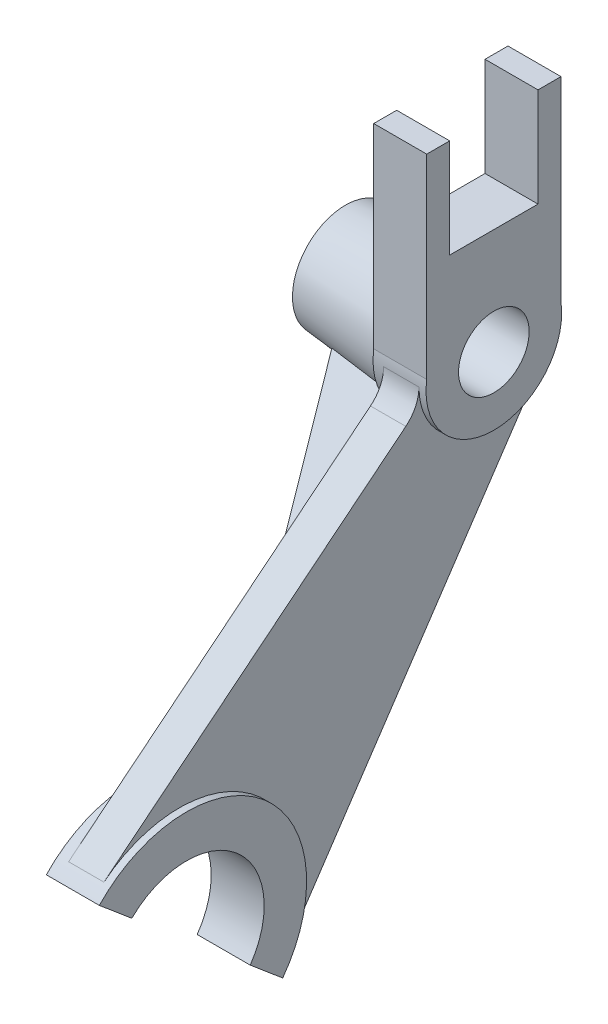
ISO-10303-21;
HEADER;
FILE_DESCRIPTION(('STEP AP214'),'2;1');
FILE_NAME('part.step','',(''),(''),'','','');
FILE_SCHEMA(('AUTOMOTIVE_DESIGN { 1 0 10303 214 1 1 1 1 }'));
ENDSEC;
DATA;
#1=APPLICATION_CONTEXT('core data for automotive mechanical design processes');
#2=APPLICATION_PROTOCOL_DEFINITION('international standard','automotive_design',2000,#1);
#3=PRODUCT_CONTEXT('',#1,'mechanical');
#4=PRODUCT('Part','Part','',(#3));
#5=PRODUCT_RELATED_PRODUCT_CATEGORY('part','',(#4));
#6=PRODUCT_DEFINITION_FORMATION('','',#4);
#7=PRODUCT_DEFINITION_CONTEXT('part definition',#1,'design');
#8=PRODUCT_DEFINITION('design','',#6,#7);
#9=PRODUCT_DEFINITION_SHAPE('','',#8);
#10=(LENGTH_UNIT() NAMED_UNIT(*) SI_UNIT(.MILLI.,.METRE.));
#11=(NAMED_UNIT(*) PLANE_ANGLE_UNIT() SI_UNIT($,.RADIAN.));
#12=(NAMED_UNIT(*) SI_UNIT($,.STERADIAN.) SOLID_ANGLE_UNIT());
#13=UNCERTAINTY_MEASURE_WITH_UNIT(LENGTH_MEASURE(1.E-05),#10,'distance_accuracy_value','');
#14=(GEOMETRIC_REPRESENTATION_CONTEXT(3) GLOBAL_UNCERTAINTY_ASSIGNED_CONTEXT((#13)) GLOBAL_UNIT_ASSIGNED_CONTEXT((#10,
#11,#12)) REPRESENTATION_CONTEXT('',''));
#15=CARTESIAN_POINT('',(0.,0.,0.));
#16=DIRECTION('',(0.,0.,1.));
#17=DIRECTION('',(1.,0.,0.));
#18=AXIS2_PLACEMENT_3D('',#15,#16,#17);
#19=CARTESIAN_POINT('',(-15.,58.,-19.));
#20=DIRECTION('',(0.,1.,0.));
#21=DIRECTION('',(0.,0.,1.));
#22=AXIS2_PLACEMENT_3D('',#19,#20,#21);
#23=PLANE('',#22);
#24=DIRECTION('',(-1.,0.,0.));
#25=VECTOR('',#24,1.);
#26=CARTESIAN_POINT('',(0.,58.,-12.5));
#27=LINE('',#26,#25);
#28=CARTESIAN_POINT('',(0.,58.,-12.5));
#29=VERTEX_POINT('',#28);
#30=CARTESIAN_POINT('',(-15.,58.,-12.5));
#31=VERTEX_POINT('',#30);
#32=EDGE_CURVE('E232',#29,#31,#27,.T.);
#33=ORIENTED_EDGE('',*,*,#32,.F.);
#34=DIRECTION('',(0.,0.,1.));
#35=VECTOR('',#34,1.);
#36=CARTESIAN_POINT('',(0.,58.,-19.));
#37=LINE('',#36,#35);
#38=CARTESIAN_POINT('',(0.,58.,-19.));
#39=VERTEX_POINT('',#38);
#40=EDGE_CURVE('E218',#39,#29,#37,.T.);
#41=ORIENTED_EDGE('',*,*,#40,.F.);
#42=DIRECTION('',(1.,0.,0.));
#43=VECTOR('',#42,1.);
#44=CARTESIAN_POINT('',(-15.,58.,-19.));
#45=LINE('',#44,#43);
#46=CARTESIAN_POINT('',(-15.,58.,-19.));
#47=VERTEX_POINT('',#46);
#48=EDGE_CURVE('E49',#47,#39,#45,.T.);
#49=ORIENTED_EDGE('',*,*,#48,.F.);
#50=DIRECTION('',(0.,0.,1.));
#51=VECTOR('',#50,1.);
#52=CARTESIAN_POINT('',(-15.,58.,-19.));
#53=LINE('',#52,#51);
#54=EDGE_CURVE('E438',#47,#31,#53,.T.);
#55=ORIENTED_EDGE('',*,*,#54,.T.);
#56=EDGE_LOOP('',(#33,#41,#49,#55));
#57=FACE_BOUND('',#56,.T.);
#58=ADVANCED_FACE('F45',(#57),#23,.T.);
#59=CARTESIAN_POINT('',(-15.,0.,0.));
#60=DIRECTION('',(1.,0.,0.));
#61=DIRECTION('',(0.,0.,-1.));
#62=AXIS2_PLACEMENT_3D('',#59,#60,#61);
#63=CYLINDRICAL_SURFACE('',#62,19.2);
#64=DIRECTION('',(1.,0.,0.));
#65=VECTOR('',#64,1.);
#66=CARTESIAN_POINT('',(-12.,0.,19.2));
#67=LINE('',#66,#65);
#68=CARTESIAN_POINT('',(-12.,0.,19.2));
#69=VERTEX_POINT('',#68);
#70=CARTESIAN_POINT('',(-2.,0.,19.2));
#71=VERTEX_POINT('',#70);
#72=EDGE_CURVE('E352',#69,#71,#67,.T.);
#73=ORIENTED_EDGE('',*,*,#72,.T.);
#74=CARTESIAN_POINT('',(-2.,0.,0.));
#75=DIRECTION('',(-1.,0.,0.));
#76=DIRECTION('',(0.,0.,-1.));
#77=AXIS2_PLACEMENT_3D('',#74,#75,#76);
#78=CIRCLE('',#77,19.2);
#79=CARTESIAN_POINT('',(-2.,-10.6892474733924,-15.9492942932462));
#80=VERTEX_POINT('',#79);
#81=EDGE_CURVE('E354',#80,#71,#78,.T.);
#82=ORIENTED_EDGE('',*,*,#81,.F.);
#83=DIRECTION('',(1.,0.,0.));
#84=VECTOR('',#83,1.);
#85=CARTESIAN_POINT('',(-12.,-10.6892474733924,-15.9492942932462));
#86=LINE('',#85,#84);
#87=CARTESIAN_POINT('',(-12.,-10.6892474733924,-15.9492942932462));
#88=VERTEX_POINT('',#87);
#89=EDGE_CURVE('E362',#88,#80,#86,.T.);
#90=ORIENTED_EDGE('',*,*,#89,.F.);
#91=CARTESIAN_POINT('',(-12.,0.,0.));
#92=DIRECTION('',(-1.,0.,0.));
#93=DIRECTION('',(0.,0.,-1.));
#94=AXIS2_PLACEMENT_3D('',#91,#92,#93);
#95=CIRCLE('',#94,19.2);
#96=CARTESIAN_POINT('',(-12.,-17.4250892946811,8.06264615820335));
#97=VERTEX_POINT('',#96);
#98=EDGE_CURVE('E523',#88,#97,#95,.T.);
#99=ORIENTED_EDGE('',*,*,#98,.T.);
#100=CARTESIAN_POINT('',(-1532.94276602805,0.,0.));
#101=DIRECTION('',(0.00334154430830063,0.645181157475145,0.764022321742413));
#102=DIRECTION('',(0.999994417025233,-0.00215591346099433,-0.00255302869412777));
#103=AXIS2_PLACEMENT_3D('',#100,#101,#102);
#104=ELLIPSE('',#103,5745.84629995954,19.2);
#105=CARTESIAN_POINT('',(-15.,-17.4207216880203,8.07207878235455));
#106=VERTEX_POINT('',#105);
#107=EDGE_CURVE('E258',#97,#106,#104,.F.);
#108=ORIENTED_EDGE('',*,*,#107,.T.);
#109=CARTESIAN_POINT('',(-15.,0.,0.));
#110=DIRECTION('',(1.,0.,0.));
#111=DIRECTION('',(0.,0.,-1.));
#112=AXIS2_PLACEMENT_3D('',#109,#110,#111);
#113=CIRCLE('',#112,19.2);
#114=CARTESIAN_POINT('',(-15.,2.76405499221725,-19.));
#115=VERTEX_POINT('',#114);
#116=EDGE_CURVE('E409',#106,#115,#113,.T.);
#117=ORIENTED_EDGE('',*,*,#116,.T.);
#118=DIRECTION('',(1.,0.,0.));
#119=VECTOR('',#118,1.);
#120=CARTESIAN_POINT('',(-15.,2.76405499221725,-19.));
#121=LINE('',#120,#119);
#122=CARTESIAN_POINT('',(0.,2.76405499221725,-19.));
#123=VERTEX_POINT('',#122);
#124=EDGE_CURVE('E418',#115,#123,#121,.T.);
#125=ORIENTED_EDGE('',*,*,#124,.T.);
#126=CARTESIAN_POINT('',(0.,0.,0.));
#127=DIRECTION('',(-1.,0.,0.));
#128=DIRECTION('',(0.,0.,1.));
#129=AXIS2_PLACEMENT_3D('',#126,#127,#128);
#130=CIRCLE('',#129,19.2);
#131=CARTESIAN_POINT('',(0.,2.76405499221726,19.));
#132=VERTEX_POINT('',#131);
#133=EDGE_CURVE('E422',#123,#132,#130,.T.);
#134=ORIENTED_EDGE('',*,*,#133,.T.);
#135=DIRECTION('',(1.,0.,0.));
#136=VECTOR('',#135,1.);
#137=CARTESIAN_POINT('',(-15.,2.76405499221726,19.));
#138=LINE('',#137,#136);
#139=CARTESIAN_POINT('',(-15.,2.76405499221726,19.));
#140=VERTEX_POINT('',#139);
#141=EDGE_CURVE('E414',#132,#140,#138,.F.);
#142=ORIENTED_EDGE('',*,*,#141,.T.);
#143=CARTESIAN_POINT('',(-15.,-10.9062092370058,15.8017277561237));
#144=VERTEX_POINT('',#143);
#145=EDGE_CURVE('E410',#140,#144,#113,.T.);
#146=ORIENTED_EDGE('',*,*,#145,.T.);
#147=CARTESIAN_POINT('',(-1532.94276602805,0.,0.));
#148=DIRECTION('',(-0.00334154430830062,0.643699931012834,0.765270692562905));
#149=DIRECTION('',(0.999994417025233,0.00215096384950634,0.00255720020382707));
#150=AXIS2_PLACEMENT_3D('',#147,#148,#149);
#151=ELLIPSE('',#150,5745.84629995955,19.2);
#152=CARTESIAN_POINT('',(-12.,-10.897652708036,15.807629975902));
#153=VERTEX_POINT('',#152);
#154=EDGE_CURVE('E279',#153,#144,#151,.F.);
#155=ORIENTED_EDGE('',*,*,#154,.F.);
#156=EDGE_CURVE('E357',#153,#69,#95,.T.);
#157=ORIENTED_EDGE('',*,*,#156,.T.);
#158=EDGE_LOOP('',(#73,#82,#90,#99,#108,#117,#125,#134,#142,#146,#155,#157));
#159=FACE_BOUND('',#158,.T.);
#160=ADVANCED_FACE('F340',(#159),#63,.T.);
#161=CARTESIAN_POINT('',(0.,0.,0.));
#162=DIRECTION('',(1.,0.,0.));
#163=DIRECTION('',(0.,0.,-1.));
#164=AXIS2_PLACEMENT_3D('',#161,#162,#163);
#165=CONICAL_SURFACE('',#164,19.2,0.0996686524911626);
#166=CARTESIAN_POINT('',(-42.,0.,0.));
#167=DIRECTION('',(-1.,0.,0.));
#168=DIRECTION('',(0.,0.,1.));
#169=AXIS2_PLACEMENT_3D('',#166,#167,#168);
#170=CIRCLE('',#169,15.);
#171=CARTESIAN_POINT('',(-42.,0.,15.));
#172=VERTEX_POINT('',#171);
#173=EDGE_CURVE('E425',#172,#172,#170,.T.);
#174=ORIENTED_EDGE('',*,*,#173,.F.);
#175=EDGE_LOOP('',(#174));
#176=FACE_BOUND('',#175,.T.);
#177=CARTESIAN_POINT('',(-15.,0.,0.));
#178=DIRECTION('',(1.,0.,0.));
#179=DIRECTION('',(0.,0.,-1.));
#180=AXIS2_PLACEMENT_3D('',#177,#178,#179);
#181=CIRCLE('',#180,17.7);
#182=CARTESIAN_POINT('',(-15.,-9.71220373720697,14.7974017505434));
#183=VERTEX_POINT('',#182);
#184=CARTESIAN_POINT('',(-15.,-16.2286639455837,7.06544170886104));
#185=VERTEX_POINT('',#184);
#186=EDGE_CURVE('E429',#183,#185,#181,.F.);
#187=ORIENTED_EDGE('',*,*,#186,.T.);
#188=CARTESIAN_POINT('',(-42.0002,-14.0241437960404,5.3219160824256));
#189=CARTESIAN_POINT('',(-39.7503512926538,-14.2092084024237,5.46835451050231));
#190=CARTESIAN_POINT('',(-37.5004477615348,-14.3938731747247,5.61445505759735));
#191=CARTESIAN_POINT('',(-33.0005446913794,-14.7624982002182,5.90606079841143));
#192=CARTESIAN_POINT('',(-30.7505451523554,-14.9464584535018,6.0515659922075));
#193=CARTESIAN_POINT('',(-26.2504631913204,-15.3137696323469,6.34206146850572));
#194=CARTESIAN_POINT('',(-24.0003807693117,-15.4971205579266,6.48705175102332));
#195=CARTESIAN_POINT('',(-19.5001427134864,-15.8632852280912,6.77657837160347));
#196=CARTESIAN_POINT('',(-17.2499870796602,-16.0460989726067,6.92111470960736));
#197=CARTESIAN_POINT('',(-14.9998,-16.2286801735038,7.06545453785717));
#198=B_SPLINE_CURVE_WITH_KNOTS('',3,(#188,#189,#190,#191,#192,#193,#194,#195,#196,#197),
.UNSPECIFIED.,.F.,.F.,(4,2,2,2,4),(0.,6.78657564667218,13.5731504152672,20.3597249802693,
27.1463004221728),.UNSPECIFIED.);
#199=CARTESIAN_POINT('',(-32.2395764194648,-14.824626665252,5.95519719759311));
#200=VERTEX_POINT('',#199);
#201=EDGE_CURVE('E265',#200,#185,#198,.T.);
#202=ORIENTED_EDGE('',*,*,#201,.F.);
#203=CARTESIAN_POINT('',(-36.5070422535211,-0.344631497396388,0.290453834115807));
#204=DIRECTION('',(-0.960466366084608,-0.212875854147871,0.179410786579411));
#205=DIRECTION('',(0.278396048140466,-0.734421696810154,0.618967213698969));
#206=AXIS2_PLACEMENT_3D('',#203,#204,#205);
#207=ELLIPSE('',#206,16.1893183600332,15.5427624568071);
#208=CARTESIAN_POINT('',(-32.2395764194648,-8.38018222080753,13.6017085460755));
#209=VERTEX_POINT('',#208);
#210=EDGE_CURVE('E69',#200,#209,#207,.T.);
#211=ORIENTED_EDGE('',*,*,#210,.T.);
#212=CARTESIAN_POINT('',(-42.0002,-7.62046383256578,12.9200592481984));
#213=CARTESIAN_POINT('',(-39.7503512926538,-7.79613302251573,13.0776455974032));
#214=CARTESIAN_POINT('',(-37.5004477615348,-7.97140148876258,13.234895121186));
#215=CARTESIAN_POINT('',(-33.0005446913794,-8.32123233716713,13.5488006722684));
#216=CARTESIAN_POINT('',(-30.7505451523554,-8.49579471941619,13.7054566996448));
#217=CARTESIAN_POINT('',(-26.2504631913204,-8.84430880332301,14.0182554483201));
#218=CARTESIAN_POINT('',(-24.0003807693117,-9.01826050499908,14.1743981696345));
#219=CARTESIAN_POINT('',(-19.5001427134864,-9.36562553405806,14.4862310836898));
#220=CARTESIAN_POINT('',(-17.2499870796602,-9.53903886137139,14.6419212763722));
#221=CARTESIAN_POINT('',(-14.9998,-9.71221912955779,14.7974155709655));
#222=B_SPLINE_CURVE_WITH_KNOTS('',3,(#212,#213,#214,#215,#216,#217,#218,#219,#220,#221),
.UNSPECIFIED.,.F.,.F.,(4,2,2,2,4),(0.,6.78657564667218,13.5731504152672,20.3597249802693,
27.1463004221728),.UNSPECIFIED.);
#223=EDGE_CURVE('E471',#209,#183,#222,.T.);
#224=ORIENTED_EDGE('',*,*,#223,.T.);
#225=EDGE_LOOP('',(#187,#202,#211,#224));
#226=FACE_BOUND('',#225,.T.);
#227=ADVANCED_FACE('F281',(#176,#226),#165,.T.);
#228=CARTESIAN_POINT('',(-15.,0.,-19.));
#229=DIRECTION('',(0.,0.,-1.));
#230=DIRECTION('',(0.,1.,0.));
#231=AXIS2_PLACEMENT_3D('',#228,#229,#230);
#232=PLANE('',#231);
#233=ORIENTED_EDGE('',*,*,#48,.T.);
#234=DIRECTION('',(0.,1.,0.));
#235=VECTOR('',#234,1.);
#236=CARTESIAN_POINT('',(0.,0.,-19.));
#237=LINE('',#236,#235);
#238=EDGE_CURVE('E432',#123,#39,#237,.T.);
#239=ORIENTED_EDGE('',*,*,#238,.F.);
#240=ORIENTED_EDGE('',*,*,#124,.F.);
#241=DIRECTION('',(0.,1.,0.));
#242=VECTOR('',#241,1.);
#243=CARTESIAN_POINT('',(-15.,0.,-19.));
#244=LINE('',#243,#242);
#245=EDGE_CURVE('E433',#115,#47,#244,.T.);
#246=ORIENTED_EDGE('',*,*,#245,.T.);
#247=EDGE_LOOP('',(#233,#239,#240,#246));
#248=FACE_BOUND('',#247,.T.);
#249=ADVANCED_FACE('F47',(#248),#232,.T.);
#250=CARTESIAN_POINT('',(-15.,0.,19.));
#251=DIRECTION('',(0.,0.,1.));
#252=DIRECTION('',(1.,0.,0.));
#253=AXIS2_PLACEMENT_3D('',#250,#251,#252);
#254=PLANE('',#253);
#255=ORIENTED_EDGE('',*,*,#141,.F.);
#256=DIRECTION('',(0.,-1.,0.));
#257=VECTOR('',#256,1.);
#258=CARTESIAN_POINT('',(0.,0.,19.));
#259=LINE('',#258,#257);
#260=CARTESIAN_POINT('',(0.,58.,19.));
#261=VERTEX_POINT('',#260);
#262=EDGE_CURVE('E437',#261,#132,#259,.T.);
#263=ORIENTED_EDGE('',*,*,#262,.F.);
#264=DIRECTION('',(1.,0.,0.));
#265=VECTOR('',#264,1.);
#266=CARTESIAN_POINT('',(-15.,58.,19.));
#267=LINE('',#266,#265);
#268=CARTESIAN_POINT('',(-15.,58.,19.));
#269=VERTEX_POINT('',#268);
#270=EDGE_CURVE('E11',#269,#261,#267,.T.);
#271=ORIENTED_EDGE('',*,*,#270,.F.);
#272=DIRECTION('',(0.,-1.,0.));
#273=VECTOR('',#272,1.);
#274=CARTESIAN_POINT('',(-15.,0.,19.));
#275=LINE('',#274,#273);
#276=EDGE_CURVE('E442',#269,#140,#275,.T.);
#277=ORIENTED_EDGE('',*,*,#276,.T.);
#278=EDGE_LOOP('',(#255,#263,#271,#277));
#279=FACE_BOUND('',#278,.T.);
#280=ADVANCED_FACE('F458',(#279),#254,.T.);
#281=DIRECTION('',(-1.,0.,0.));
#282=VECTOR('',#281,1.);
#283=CARTESIAN_POINT('',(0.,58.,12.5));
#284=LINE('',#283,#282);
#285=CARTESIAN_POINT('',(0.,58.,12.5));
#286=VERTEX_POINT('',#285);
#287=CARTESIAN_POINT('',(-15.,58.,12.5));
#288=VERTEX_POINT('',#287);
#289=EDGE_CURVE('E236',#286,#288,#284,.T.);
#290=ORIENTED_EDGE('',*,*,#289,.T.);
#291=EDGE_CURVE('E436',#288,#269,#53,.T.);
#292=ORIENTED_EDGE('',*,*,#291,.T.);
#293=ORIENTED_EDGE('',*,*,#270,.T.);
#294=EDGE_CURVE('E447',#286,#261,#37,.T.);
#295=ORIENTED_EDGE('',*,*,#294,.F.);
#296=EDGE_LOOP('',(#290,#292,#293,#295));
#297=FACE_BOUND('',#296,.T.);
#298=ADVANCED_FACE('F349',(#297),#23,.T.);
#299=CARTESIAN_POINT('',(-15.,0.,0.));
#300=DIRECTION('',(1.,0.,0.));
#301=DIRECTION('',(0.,0.,-1.));
#302=AXIS2_PLACEMENT_3D('',#299,#300,#301);
#303=PLANE('',#302);
#304=DIRECTION('',(0.,0.,1.));
#305=VECTOR('',#304,1.);
#306=CARTESIAN_POINT('',(-15.,30.,-12.5));
#307=LINE('',#306,#305);
#308=CARTESIAN_POINT('',(-15.,30.,-12.5));
#309=VERTEX_POINT('',#308);
#310=CARTESIAN_POINT('',(-15.,30.,12.5));
#311=VERTEX_POINT('',#310);
#312=EDGE_CURVE('E223',#309,#311,#307,.T.);
#313=ORIENTED_EDGE('',*,*,#312,.F.);
#314=DIRECTION('',(0.,-1.,0.));
#315=VECTOR('',#314,1.);
#316=CARTESIAN_POINT('',(-15.,58.,-12.5));
#317=LINE('',#316,#315);
#318=EDGE_CURVE('E201',#31,#309,#317,.T.);
#319=ORIENTED_EDGE('',*,*,#318,.F.);
#320=ORIENTED_EDGE('',*,*,#54,.F.);
#321=ORIENTED_EDGE('',*,*,#245,.F.);
#322=ORIENTED_EDGE('',*,*,#116,.F.);
#323=DIRECTION('',(0.,-0.764026587283571,0.645184759525378));
#324=VECTOR('',#323,1.);
#325=CARTESIAN_POINT('',(-15.,-3.27257151298303,-3.87537307382337));
#326=LINE('',#325,#324);
#327=EDGE_CURVE('E261',#185,#106,#326,.T.);
#328=ORIENTED_EDGE('',*,*,#327,.F.);
#329=ORIENTED_EDGE('',*,*,#186,.F.);
#330=DIRECTION('',(0.,-0.765274965073725,0.64370352479337));
#331=VECTOR('',#330,1.);
#332=CARTESIAN_POINT('',(-15.,3.26505824408378,3.88170522214706));
#333=LINE('',#332,#331);
#334=EDGE_CURVE('E467',#183,#144,#333,.T.);
#335=ORIENTED_EDGE('',*,*,#334,.T.);
#336=ORIENTED_EDGE('',*,*,#145,.F.);
#337=ORIENTED_EDGE('',*,*,#276,.F.);
#338=ORIENTED_EDGE('',*,*,#291,.F.);
#339=DIRECTION('',(0.,1.,0.));
#340=VECTOR('',#339,1.);
#341=CARTESIAN_POINT('',(-15.,58.,12.5));
#342=LINE('',#341,#340);
#343=EDGE_CURVE('E220',#311,#288,#342,.T.);
#344=ORIENTED_EDGE('',*,*,#343,.F.);
#345=EDGE_LOOP('',(#313,#319,#320,#321,#322,#328,#329,#335,#336,#337,#338,#344));
#346=FACE_BOUND('',#345,.T.);
#347=ADVANCED_FACE('F463',(#346),#303,.F.);
#348=CARTESIAN_POINT('',(0.,0.,0.));
#349=DIRECTION('',(1.,0.,0.));
#350=DIRECTION('',(0.,0.,-1.));
#351=AXIS2_PLACEMENT_3D('',#348,#349,#350);
#352=PLANE('',#351);
#353=DIRECTION('',(0.,-1.,0.));
#354=VECTOR('',#353,1.);
#355=CARTESIAN_POINT('',(0.,58.,-12.5));
#356=LINE('',#355,#354);
#357=CARTESIAN_POINT('',(0.,30.,-12.5));
#358=VERTEX_POINT('',#357);
#359=EDGE_CURVE('E198',#29,#358,#356,.T.);
#360=ORIENTED_EDGE('',*,*,#359,.T.);
#361=DIRECTION('',(0.,0.,1.));
#362=VECTOR('',#361,1.);
#363=CARTESIAN_POINT('',(0.,30.,-12.5));
#364=LINE('',#363,#362);
#365=CARTESIAN_POINT('',(0.,30.,12.5));
#366=VERTEX_POINT('',#365);
#367=EDGE_CURVE('E209',#358,#366,#364,.T.);
#368=ORIENTED_EDGE('',*,*,#367,.T.);
#369=DIRECTION('',(0.,1.,0.));
#370=VECTOR('',#369,1.);
#371=CARTESIAN_POINT('',(0.,58.,12.5));
#372=LINE('',#371,#370);
#373=EDGE_CURVE('E61',#366,#286,#372,.T.);
#374=ORIENTED_EDGE('',*,*,#373,.T.);
#375=ORIENTED_EDGE('',*,*,#294,.T.);
#376=ORIENTED_EDGE('',*,*,#262,.T.);
#377=ORIENTED_EDGE('',*,*,#133,.F.);
#378=ORIENTED_EDGE('',*,*,#238,.T.);
#379=ORIENTED_EDGE('',*,*,#40,.T.);
#380=EDGE_LOOP('',(#360,#368,#374,#375,#376,#377,#378,#379));
#381=FACE_BOUND('',#380,.T.);
#382=CARTESIAN_POINT('',(0.,0.,0.));
#383=DIRECTION('',(-1.,0.,0.));
#384=DIRECTION('',(0.,0.,1.));
#385=AXIS2_PLACEMENT_3D('',#382,#383,#384);
#386=CIRCLE('',#385,10.);
#387=CARTESIAN_POINT('',(0.,0.,10.));
#388=VERTEX_POINT('',#387);
#389=EDGE_CURVE('E242',#388,#388,#386,.T.);
#390=ORIENTED_EDGE('',*,*,#389,.T.);
#391=EDGE_LOOP('',(#390));
#392=FACE_BOUND('',#391,.T.);
#393=ADVANCED_FACE('F215',(#381,#392),#352,.T.);
#394=CARTESIAN_POINT('',(-42.,0.,0.));
#395=DIRECTION('',(1.,0.,0.));
#396=DIRECTION('',(0.,0.,-1.));
#397=AXIS2_PLACEMENT_3D('',#394,#395,#396);
#398=PLANE('',#397);
#399=CARTESIAN_POINT('',(-42.,0.,0.));
#400=DIRECTION('',(-1.,0.,0.));
#401=DIRECTION('',(0.,0.,1.));
#402=AXIS2_PLACEMENT_3D('',#399,#400,#401);
#403=CIRCLE('',#402,10.);
#404=CARTESIAN_POINT('',(-42.,0.,10.));
#405=VERTEX_POINT('',#404);
#406=EDGE_CURVE('E235',#405,#405,#403,.T.);
#407=ORIENTED_EDGE('',*,*,#406,.F.);
#408=EDGE_LOOP('',(#407));
#409=FACE_BOUND('',#408,.T.);
#410=ORIENTED_EDGE('',*,*,#173,.T.);
#411=EDGE_LOOP('',(#410));
#412=FACE_BOUND('',#411,.T.);
#413=ADVANCED_FACE('F321',(#409,#412),#398,.F.);
#414=CARTESIAN_POINT('',(-12.,-76.7754429270129,108.360415381433));
#415=DIRECTION('',(0.,0.77801353757349,0.628247511218615));
#416=DIRECTION('',(0.,-0.628247511218615,0.77801353757349));
#417=AXIS2_PLACEMENT_3D('',#414,#415,#416);
#418=PLANE('',#417);
#419=DIRECTION('',(0.,-0.628247511218615,0.77801353757349));
#420=VECTOR('',#419,1.);
#421=CARTESIAN_POINT('',(-2.,-76.7754429270129,108.360415381433));
#422=LINE('',#421,#420);
#423=CARTESIAN_POINT('',(-2.,-7.78013537573488,22.9175248878139));
#424=VERTEX_POINT('',#423);
#425=CARTESIAN_POINT('',(-2.,-76.7754429270129,108.360415381433));
#426=VERTEX_POINT('',#425);
#427=EDGE_CURVE('E369',#424,#426,#422,.T.);
#428=ORIENTED_EDGE('',*,*,#427,.F.);
#429=DIRECTION('',(1.,0.,0.));
#430=VECTOR('',#429,1.);
#431=CARTESIAN_POINT('',(-12.,-7.78013537573488,22.9175248878139));
#432=LINE('',#431,#430);
#433=CARTESIAN_POINT('',(-12.,-7.78013537573488,22.9175248878139));
#434=VERTEX_POINT('',#433);
#435=EDGE_CURVE('E361',#434,#424,#432,.T.);
#436=ORIENTED_EDGE('',*,*,#435,.F.);
#437=DIRECTION('',(0.,-0.628247511218615,0.77801353757349));
#438=VECTOR('',#437,1.);
#439=CARTESIAN_POINT('',(-12.,-76.7754429270129,108.360415381433));
#440=LINE('',#439,#438);
#441=CARTESIAN_POINT('',(-12.,-76.7754429270129,108.360415381433));
#442=VERTEX_POINT('',#441);
#443=EDGE_CURVE('E406',#434,#442,#440,.T.);
#444=ORIENTED_EDGE('',*,*,#443,.T.);
#445=DIRECTION('',(1.,0.,0.));
#446=VECTOR('',#445,1.);
#447=CARTESIAN_POINT('',(-12.,-76.7754429270129,108.360415381433));
#448=LINE('',#447,#446);
#449=EDGE_CURVE('E379',#442,#426,#448,.T.);
#450=ORIENTED_EDGE('',*,*,#449,.T.);
#451=EDGE_LOOP('',(#428,#436,#444,#450));
#452=FACE_BOUND('',#451,.T.);
#453=ADVANCED_FACE('F317',(#452),#418,.T.);
#454=CARTESIAN_POINT('',(-12.,0.,29.2));
#455=DIRECTION('',(1.,0.,0.));
#456=DIRECTION('',(0.,0.,-1.));
#457=AXIS2_PLACEMENT_3D('',#454,#455,#456);
#458=CYLINDRICAL_SURFACE('',#457,9.99999999999999);
#459=CARTESIAN_POINT('',(-2.,0.,29.2));
#460=DIRECTION('',(-1.,0.,0.));
#461=DIRECTION('',(0.,0.,-1.));
#462=AXIS2_PLACEMENT_3D('',#459,#460,#461);
#463=CIRCLE('',#462,9.99999999999999);
#464=EDGE_CURVE('E365',#71,#424,#463,.T.);
#465=ORIENTED_EDGE('',*,*,#464,.F.);
#466=ORIENTED_EDGE('',*,*,#72,.F.);
#467=CARTESIAN_POINT('',(-12.,0.,29.2));
#468=DIRECTION('',(-1.,0.,0.));
#469=DIRECTION('',(0.,0.,-1.));
#470=AXIS2_PLACEMENT_3D('',#467,#468,#469);
#471=CIRCLE('',#470,9.99999999999999);
#472=EDGE_CURVE('E527',#69,#434,#471,.T.);
#473=ORIENTED_EDGE('',*,*,#472,.T.);
#474=ORIENTED_EDGE('',*,*,#435,.T.);
#475=EDGE_LOOP('',(#465,#466,#473,#474));
#476=FACE_BOUND('',#475,.T.);
#477=ADVANCED_FACE('F320',(#476),#458,.F.);
#478=CARTESIAN_POINT('',(-12.,-122.156778938644,58.7564580223765));
#479=DIRECTION('',(0.,-0.556731639239186,-0.830692411106571));
#480=DIRECTION('',(0.,0.830692411106572,-0.556731639239186));
#481=AXIS2_PLACEMENT_3D('',#478,#479,#480);
#482=PLANE('',#481);
#483=DIRECTION('',(0.,0.830692411106572,-0.556731639239186));
#484=VECTOR('',#483,1.);
#485=CARTESIAN_POINT('',(-2.,-122.156778938644,58.7564580223765));
#486=LINE('',#485,#484);
#487=CARTESIAN_POINT('',(-2.,-122.156778938644,58.7564580223765));
#488=VERTEX_POINT('',#487);
#489=EDGE_CURVE('E375',#488,#80,#486,.T.);
#490=ORIENTED_EDGE('',*,*,#489,.F.);
#491=DIRECTION('',(1.,0.,0.));
#492=VECTOR('',#491,1.);
#493=CARTESIAN_POINT('',(-12.,-122.156778938644,58.7564580223765));
#494=LINE('',#493,#492);
#495=CARTESIAN_POINT('',(-12.,-122.156778938644,58.7564580223765));
#496=VERTEX_POINT('',#495);
#497=EDGE_CURVE('E388',#496,#488,#494,.T.);
#498=ORIENTED_EDGE('',*,*,#497,.F.);
#499=DIRECTION('',(0.,0.830692411106572,-0.556731639239186));
#500=VECTOR('',#499,1.);
#501=CARTESIAN_POINT('',(-12.,-122.156778938644,58.7564580223765));
#502=LINE('',#501,#500);
#503=EDGE_CURVE('E373',#496,#88,#502,.T.);
#504=ORIENTED_EDGE('',*,*,#503,.T.);
#505=ORIENTED_EDGE('',*,*,#89,.T.);
#506=EDGE_LOOP('',(#490,#498,#504,#505));
#507=FACE_BOUND('',#506,.T.);
#508=ADVANCED_FACE('F312',(#507),#482,.T.);
#509=CARTESIAN_POINT('',(-12.,0.,29.2));
#510=DIRECTION('',(1.,0.,0.));
#511=DIRECTION('',(0.,0.,-1.));
#512=AXIS2_PLACEMENT_3D('',#509,#510,#511);
#513=PLANE('',#512);
#514=ORIENTED_EDGE('',*,*,#156,.F.);
#515=DIRECTION('',(0.,-0.765274965073725,0.64370352479337));
#516=VECTOR('',#515,1.);
#517=CARTESIAN_POINT('',(-12.,-11.1127064480003,15.9885203182663));
#518=LINE('',#517,#516);
#519=CARTESIAN_POINT('',(-12.,-61.7731242398776,58.6010334520189));
#520=VERTEX_POINT('',#519);
#521=EDGE_CURVE('E278',#153,#520,#518,.T.);
#522=ORIENTED_EDGE('',*,*,#521,.T.);
#523=DIRECTION('',(0.,-0.644444444444444,-0.764651134848234));
#524=VECTOR('',#523,1.);
#525=CARTESIAN_POINT('',(-12.,-50.6063113290002,71.8507654320988));
#526=LINE('',#525,#524);
#527=CARTESIAN_POINT('',(-12.,-68.2175686843221,50.9545221035366));
#528=VERTEX_POINT('',#527);
#529=EDGE_CURVE('E474',#520,#528,#526,.T.);
#530=ORIENTED_EDGE('',*,*,#529,.T.);
#531=DIRECTION('',(0.,-0.764026587283571,0.645184759525378));
#532=VECTOR('',#531,1.);
#533=CARTESIAN_POINT('',(-12.,-17.6728379411118,8.27185831590907));
#534=LINE('',#533,#532);
#535=EDGE_CURVE('E254',#97,#528,#534,.T.);
#536=ORIENTED_EDGE('',*,*,#535,.F.);
#537=ORIENTED_EDGE('',*,*,#98,.F.);
#538=ORIENTED_EDGE('',*,*,#503,.F.);
#539=CARTESIAN_POINT('',(-12.,-103.227903204512,87.));
#540=DIRECTION('',(1.,0.,0.));
#541=DIRECTION('',(0.,0.,-1.));
#542=AXIS2_PLACEMENT_3D('',#539,#540,#541);
#543=CIRCLE('',#542,34.);
#544=EDGE_CURVE('E505',#496,#442,#543,.T.);
#545=ORIENTED_EDGE('',*,*,#544,.T.);
#546=ORIENTED_EDGE('',*,*,#443,.F.);
#547=ORIENTED_EDGE('',*,*,#472,.F.);
#548=EDGE_LOOP('',(#514,#522,#530,#536,#537,#538,#545,#546,#547));
#549=FACE_BOUND('',#548,.T.);
#550=ADVANCED_FACE('F309',(#549),#513,.F.);
#551=CARTESIAN_POINT('',(-2.,0.,29.2));
#552=DIRECTION('',(1.,0.,0.));
#553=DIRECTION('',(0.,0.,-1.));
#554=AXIS2_PLACEMENT_3D('',#551,#552,#553);
#555=PLANE('',#554);
#556=ORIENTED_EDGE('',*,*,#427,.T.);
#557=CARTESIAN_POINT('',(-2.,-103.227903204512,87.));
#558=DIRECTION('',(1.,0.,0.));
#559=DIRECTION('',(0.,0.,-1.));
#560=AXIS2_PLACEMENT_3D('',#557,#558,#559);
#561=CIRCLE('',#560,34.);
#562=EDGE_CURVE('E383',#488,#426,#561,.T.);
#563=ORIENTED_EDGE('',*,*,#562,.F.);
#564=ORIENTED_EDGE('',*,*,#489,.T.);
#565=ORIENTED_EDGE('',*,*,#81,.T.);
#566=ORIENTED_EDGE('',*,*,#464,.T.);
#567=EDGE_LOOP('',(#556,#563,#564,#565,#566));
#568=FACE_BOUND('',#567,.T.);
#569=ADVANCED_FACE('F307',(#568),#555,.T.);
#570=CARTESIAN_POINT('',(-15.,-103.227903204512,87.));
#571=DIRECTION('',(1.,0.,0.));
#572=DIRECTION('',(0.,0.,-1.));
#573=AXIS2_PLACEMENT_3D('',#570,#571,#572);
#574=CYLINDRICAL_SURFACE('',#573,34.);
#575=DIRECTION('',(1.,0.,0.));
#576=VECTOR('',#575,1.);
#577=CARTESIAN_POINT('',(-12.,-79.8254311701112,111.664231240383));
#578=LINE('',#577,#576);
#579=CARTESIAN_POINT('',(-15.,-79.8254311701112,111.664231240383));
#580=VERTEX_POINT('',#579);
#581=CARTESIAN_POINT('',(0.,-79.8254311701112,111.664231240383));
#582=VERTEX_POINT('',#581);
#583=EDGE_CURVE('E402',#580,#582,#578,.T.);
#584=ORIENTED_EDGE('',*,*,#583,.T.);
#585=CARTESIAN_POINT('',(0.,-103.227903204512,87.));
#586=DIRECTION('',(1.,0.,0.));
#587=DIRECTION('',(0.,0.,-1.));
#588=AXIS2_PLACEMENT_3D('',#585,#586,#587);
#589=CIRCLE('',#588,34.);
#590=CARTESIAN_POINT('',(0.,-123.571770699519,59.7579909818387));
#591=VERTEX_POINT('',#590);
#592=EDGE_CURVE('E487',#591,#582,#589,.T.);
#593=ORIENTED_EDGE('',*,*,#592,.F.);
#594=DIRECTION('',(1.,0.,0.));
#595=VECTOR('',#594,1.);
#596=CARTESIAN_POINT('',(-12.,-123.571770699519,59.7579909818387));
#597=LINE('',#596,#595);
#598=CARTESIAN_POINT('',(-15.,-123.571770699519,59.7579909818387));
#599=VERTEX_POINT('',#598);
#600=EDGE_CURVE('E392',#599,#591,#597,.T.);
#601=ORIENTED_EDGE('',*,*,#600,.F.);
#602=CARTESIAN_POINT('',(-15.,-103.227903204512,87.));
#603=DIRECTION('',(1.,0.,0.));
#604=DIRECTION('',(0.,0.,-1.));
#605=AXIS2_PLACEMENT_3D('',#602,#603,#604);
#606=CIRCLE('',#605,34.);
#607=EDGE_CURVE('E488',#599,#580,#606,.T.);
#608=ORIENTED_EDGE('',*,*,#607,.T.);
#609=EDGE_LOOP('',(#584,#593,#601,#608));
#610=FACE_BOUND('',#609,.T.);
#611=ORIENTED_EDGE('',*,*,#562,.T.);
#612=ORIENTED_EDGE('',*,*,#449,.F.);
#613=ORIENTED_EDGE('',*,*,#544,.F.);
#614=ORIENTED_EDGE('',*,*,#497,.T.);
#615=EDGE_LOOP('',(#611,#612,#613,#614));
#616=FACE_BOUND('',#615,.T.);
#617=ADVANCED_FACE('F299',(#610,#616),#574,.T.);
#618=CARTESIAN_POINT('',(-15.,-103.227903204512,87.));
#619=DIRECTION('',(1.,0.,0.));
#620=DIRECTION('',(0.,0.,-1.));
#621=AXIS2_PLACEMENT_3D('',#618,#619,#620);
#622=PLANE('',#621);
#623=ORIENTED_EDGE('',*,*,#607,.F.);
#624=DIRECTION('',(0.,-0.644444444444444,-0.764651134848234));
#625=VECTOR('',#624,1.);
#626=CARTESIAN_POINT('',(-15.,-115.817671306059,68.958444103979));
#627=LINE('',#626,#625);
#628=CARTESIAN_POINT('',(-15.,-115.817671306059,68.958444103979));
#629=VERTEX_POINT('',#628);
#630=EDGE_CURVE('E501',#629,#599,#627,.T.);
#631=ORIENTED_EDGE('',*,*,#630,.F.);
#632=CARTESIAN_POINT('',(-15.,-103.227903204512,87.));
#633=DIRECTION('',(-1.,0.,0.));
#634=DIRECTION('',(0.,0.,-1.));
#635=AXIS2_PLACEMENT_3D('',#632,#633,#634);
#636=CIRCLE('',#635,22.);
#637=CARTESIAN_POINT('',(-15.,-87.5795305635708,102.463778118243));
#638=VERTEX_POINT('',#637);
#639=EDGE_CURVE('E497',#638,#629,#636,.T.);
#640=ORIENTED_EDGE('',*,*,#639,.F.);
#641=DIRECTION('',(0.,-0.644444444444443,-0.764651134848235));
#642=VECTOR('',#641,1.);
#643=CARTESIAN_POINT('',(-15.,-79.8254311701112,111.664231240383));
#644=LINE('',#643,#642);
#645=EDGE_CURVE('E492',#580,#638,#644,.T.);
#646=ORIENTED_EDGE('',*,*,#645,.F.);
#647=EDGE_LOOP('',(#623,#631,#640,#646));
#648=FACE_BOUND('',#647,.T.);
#649=ADVANCED_FACE('F295',(#648),#622,.F.);
#650=CARTESIAN_POINT('',(0.,-103.227903204512,87.));
#651=DIRECTION('',(1.,0.,0.));
#652=DIRECTION('',(0.,0.,-1.));
#653=AXIS2_PLACEMENT_3D('',#650,#651,#652);
#654=PLANE('',#653);
#655=CARTESIAN_POINT('',(0.,-103.227903204512,87.));
#656=DIRECTION('',(-1.,0.,0.));
#657=DIRECTION('',(0.,0.,-1.));
#658=AXIS2_PLACEMENT_3D('',#655,#656,#657);
#659=CIRCLE('',#658,22.);
#660=CARTESIAN_POINT('',(0.,-87.5795305635708,102.463778118243));
#661=VERTEX_POINT('',#660);
#662=CARTESIAN_POINT('',(0.,-115.817671306059,68.958444103979));
#663=VERTEX_POINT('',#662);
#664=EDGE_CURVE('E512',#661,#663,#659,.T.);
#665=ORIENTED_EDGE('',*,*,#664,.T.);
#666=DIRECTION('',(0.,-0.644444444444444,-0.764651134848234));
#667=VECTOR('',#666,1.);
#668=CARTESIAN_POINT('',(0.,-115.817671306059,68.958444103979));
#669=LINE('',#668,#667);
#670=EDGE_CURVE('E493',#663,#591,#669,.T.);
#671=ORIENTED_EDGE('',*,*,#670,.T.);
#672=ORIENTED_EDGE('',*,*,#592,.T.);
#673=DIRECTION('',(0.,-0.644444444444443,-0.764651134848235));
#674=VECTOR('',#673,1.);
#675=CARTESIAN_POINT('',(0.,-79.8254311701112,111.664231240383));
#676=LINE('',#675,#674);
#677=EDGE_CURVE('E508',#582,#661,#676,.T.);
#678=ORIENTED_EDGE('',*,*,#677,.T.);
#679=EDGE_LOOP('',(#665,#671,#672,#678));
#680=FACE_BOUND('',#679,.T.);
#681=ADVANCED_FACE('F298',(#680),#654,.T.);
#682=CARTESIAN_POINT('',(-12.,-79.8254311701112,111.664231240383));
#683=DIRECTION('',(0.,-0.764651134848234,0.644444444444444));
#684=DIRECTION('',(0.,-0.644444444444444,-0.764651134848234));
#685=AXIS2_PLACEMENT_3D('',#682,#683,#684);
#686=PLANE('',#685);
#687=DIRECTION('',(1.,0.,0.));
#688=VECTOR('',#687,1.);
#689=CARTESIAN_POINT('',(-12.,-87.5795305635708,102.463778118243));
#690=LINE('',#689,#688);
#691=EDGE_CURVE('E399',#638,#661,#690,.T.);
#692=ORIENTED_EDGE('',*,*,#691,.T.);
#693=ORIENTED_EDGE('',*,*,#677,.F.);
#694=ORIENTED_EDGE('',*,*,#583,.F.);
#695=ORIENTED_EDGE('',*,*,#645,.T.);
#696=EDGE_LOOP('',(#692,#693,#694,#695));
#697=FACE_BOUND('',#696,.T.);
#698=ADVANCED_FACE('F303',(#697),#686,.T.);
#699=CARTESIAN_POINT('',(-12.,-103.227903204512,87.));
#700=DIRECTION('',(1.,0.,0.));
#701=DIRECTION('',(0.,0.,-1.));
#702=AXIS2_PLACEMENT_3D('',#699,#700,#701);
#703=CYLINDRICAL_SURFACE('',#702,22.);
#704=DIRECTION('',(1.,0.,0.));
#705=VECTOR('',#704,1.);
#706=CARTESIAN_POINT('',(-12.,-115.817671306059,68.958444103979));
#707=LINE('',#706,#705);
#708=EDGE_CURVE('E395',#629,#663,#707,.T.);
#709=ORIENTED_EDGE('',*,*,#708,.T.);
#710=ORIENTED_EDGE('',*,*,#664,.F.);
#711=ORIENTED_EDGE('',*,*,#691,.F.);
#712=ORIENTED_EDGE('',*,*,#639,.T.);
#713=EDGE_LOOP('',(#709,#710,#711,#712));
#714=FACE_BOUND('',#713,.T.);
#715=ADVANCED_FACE('F333',(#714),#703,.F.);
#716=CARTESIAN_POINT('',(-12.,-115.817671306059,68.958444103979));
#717=DIRECTION('',(0.,-0.764651134848234,0.644444444444444));
#718=DIRECTION('',(0.,-0.644444444444444,-0.764651134848234));
#719=AXIS2_PLACEMENT_3D('',#716,#717,#718);
#720=PLANE('',#719);
#721=ORIENTED_EDGE('',*,*,#600,.T.);
#722=ORIENTED_EDGE('',*,*,#670,.F.);
#723=ORIENTED_EDGE('',*,*,#708,.F.);
#724=ORIENTED_EDGE('',*,*,#630,.T.);
#725=EDGE_LOOP('',(#721,#722,#723,#724));
#726=FACE_BOUND('',#725,.T.);
#727=ADVANCED_FACE('F329',(#726),#720,.T.);
#728=CARTESIAN_POINT('',(-32.,-12.2344181575717,10.3111111111111));
#729=DIRECTION('',(-0.960466366084608,-0.212875854147871,0.179410786579411));
#730=DIRECTION('',(0.278396048140466,-0.734421696810154,0.618967213698969));
#731=AXIS2_PLACEMENT_3D('',#728,#729,#730);
#732=PLANE('',#731);
#733=ORIENTED_EDGE('',*,*,#210,.F.);
#734=DIRECTION('',(-0.278396048140466,0.734421696810154,-0.618967213698969));
#735=VECTOR('',#734,1.);
#736=CARTESIAN_POINT('',(-32.,-15.456640379794,6.48785543686994));
#737=LINE('',#736,#735);
#738=EDGE_CURVE('E246',#200,#528,#737,.F.);
#739=ORIENTED_EDGE('',*,*,#738,.T.);
#740=ORIENTED_EDGE('',*,*,#529,.F.);
#741=DIRECTION('',(0.278396048140466,-0.734421696810154,0.618967213698969));
#742=VECTOR('',#741,1.);
#743=CARTESIAN_POINT('',(-20.7556604498469,-38.6752855772193,39.1342817185259));
#744=LINE('',#743,#742);
#745=EDGE_CURVE('E250',#209,#520,#744,.T.);
#746=ORIENTED_EDGE('',*,*,#745,.F.);
#747=EDGE_LOOP('',(#733,#739,#740,#746));
#748=FACE_BOUND('',#747,.T.);
#749=ADVANCED_FACE('F332',(#748),#732,.T.);
#750=CARTESIAN_POINT('',(-20.7556604498469,-38.6752855772193,39.1342817185259));
#751=DIRECTION('',(-0.00334154430830062,0.643699931012834,0.765270692562905));
#752=DIRECTION('',(0.,-0.765274965073725,0.64370352479337));
#753=AXIS2_PLACEMENT_3D('',#750,#751,#752);
#754=PLANE('',#753);
#755=ORIENTED_EDGE('',*,*,#223,.F.);
#756=ORIENTED_EDGE('',*,*,#745,.T.);
#757=ORIENTED_EDGE('',*,*,#521,.F.);
#758=ORIENTED_EDGE('',*,*,#154,.T.);
#759=ORIENTED_EDGE('',*,*,#334,.F.);
#760=EDGE_LOOP('',(#755,#756,#757,#758,#759));
#761=FACE_BOUND('',#760,.T.);
#762=ADVANCED_FACE('F291',(#761),#754,.T.);
#763=CARTESIAN_POINT('',(-20.7556604498469,-45.1197300216637,31.4877703700436));
#764=DIRECTION('',(0.00334154430830063,0.645181157475145,0.764022321742413));
#765=DIRECTION('',(0.,-0.764026587283571,0.645184759525378));
#766=AXIS2_PLACEMENT_3D('',#763,#764,#765);
#767=PLANE('',#766);
#768=ORIENTED_EDGE('',*,*,#738,.F.);
#769=ORIENTED_EDGE('',*,*,#201,.T.);
#770=ORIENTED_EDGE('',*,*,#327,.T.);
#771=ORIENTED_EDGE('',*,*,#107,.F.);
#772=ORIENTED_EDGE('',*,*,#535,.T.);
#773=EDGE_LOOP('',(#768,#769,#770,#771,#772));
#774=FACE_BOUND('',#773,.T.);
#775=ADVANCED_FACE('F285',(#774),#767,.F.);
#776=CARTESIAN_POINT('',(0.,0.,0.));
#777=DIRECTION('',(-1.,0.,0.));
#778=DIRECTION('',(0.,0.,1.));
#779=AXIS2_PLACEMENT_3D('',#776,#777,#778);
#780=CYLINDRICAL_SURFACE('',#779,10.);
#781=CARTESIAN_POINT('',(0.,0.,10.));
#782=CARTESIAN_POINT('',(-0.437499999999999,0.,10.));
#783=CARTESIAN_POINT('',(-0.875,0.,10.));
#784=CARTESIAN_POINT('',(-1.75,0.,10.));
#785=CARTESIAN_POINT('',(-2.1875,0.,10.));
#786=CARTESIAN_POINT('',(-3.0625,0.,10.));
#787=CARTESIAN_POINT('',(-3.5,0.,10.));
#788=CARTESIAN_POINT('',(-4.375,0.,10.));
#789=CARTESIAN_POINT('',(-4.8125,0.,10.));
#790=CARTESIAN_POINT('',(-5.6875,0.,10.));
#791=CARTESIAN_POINT('',(-6.125,0.,10.));
#792=CARTESIAN_POINT('',(-7.,0.,10.));
#793=CARTESIAN_POINT('',(-7.4375,0.,10.));
#794=CARTESIAN_POINT('',(-8.3125,0.,10.));
#795=CARTESIAN_POINT('',(-8.75,0.,10.));
#796=CARTESIAN_POINT('',(-9.625,0.,10.));
#797=CARTESIAN_POINT('',(-10.0625,0.,10.));
#798=CARTESIAN_POINT('',(-10.9375,0.,10.));
#799=CARTESIAN_POINT('',(-11.375,0.,10.));
#800=CARTESIAN_POINT('',(-12.25,0.,10.));
#801=CARTESIAN_POINT('',(-12.6875,0.,10.));
#802=CARTESIAN_POINT('',(-13.5625,0.,10.));
#803=CARTESIAN_POINT('',(-14.,0.,10.));
#804=CARTESIAN_POINT('',(-14.875,0.,10.));
#805=CARTESIAN_POINT('',(-15.3125,0.,10.));
#806=CARTESIAN_POINT('',(-16.1875,0.,10.));
#807=CARTESIAN_POINT('',(-16.625,0.,10.));
#808=CARTESIAN_POINT('',(-17.5,0.,10.));
#809=CARTESIAN_POINT('',(-17.9375,0.,10.));
#810=CARTESIAN_POINT('',(-18.8125,0.,10.));
#811=CARTESIAN_POINT('',(-19.25,0.,10.));
#812=CARTESIAN_POINT('',(-20.125,0.,10.));
#813=CARTESIAN_POINT('',(-20.5625,0.,10.));
#814=CARTESIAN_POINT('',(-21.4375,0.,10.));
#815=CARTESIAN_POINT('',(-21.875,0.,10.));
#816=CARTESIAN_POINT('',(-22.75,0.,10.));
#817=CARTESIAN_POINT('',(-23.1875,0.,10.));
#818=CARTESIAN_POINT('',(-24.0625,0.,10.));
#819=CARTESIAN_POINT('',(-24.5,0.,10.));
#820=CARTESIAN_POINT('',(-25.375,0.,10.));
#821=CARTESIAN_POINT('',(-25.8125,0.,10.));
#822=CARTESIAN_POINT('',(-26.6875,0.,10.));
#823=CARTESIAN_POINT('',(-27.125,0.,10.));
#824=CARTESIAN_POINT('',(-28.,0.,10.));
#825=CARTESIAN_POINT('',(-28.4375,0.,10.));
#826=CARTESIAN_POINT('',(-29.3125,0.,10.));
#827=CARTESIAN_POINT('',(-29.75,0.,10.));
#828=CARTESIAN_POINT('',(-30.625,0.,10.));
#829=CARTESIAN_POINT('',(-31.0625,0.,10.));
#830=CARTESIAN_POINT('',(-31.9375,0.,10.));
#831=CARTESIAN_POINT('',(-32.375,0.,10.));
#832=CARTESIAN_POINT('',(-33.25,0.,10.));
#833=CARTESIAN_POINT('',(-33.6875,0.,10.));
#834=CARTESIAN_POINT('',(-34.5625,0.,10.));
#835=CARTESIAN_POINT('',(-35.,0.,10.));
#836=CARTESIAN_POINT('',(-35.875,0.,10.));
#837=CARTESIAN_POINT('',(-36.3125,0.,10.));
#838=CARTESIAN_POINT('',(-37.1875,0.,10.));
#839=CARTESIAN_POINT('',(-37.625,0.,10.));
#840=CARTESIAN_POINT('',(-38.5,0.,10.));
#841=CARTESIAN_POINT('',(-38.9375,0.,10.));
#842=CARTESIAN_POINT('',(-39.8125,0.,10.));
#843=CARTESIAN_POINT('',(-40.25,0.,10.));
#844=CARTESIAN_POINT('',(-41.125,0.,10.));
#845=CARTESIAN_POINT('',(-41.5625,0.,10.));
#846=CARTESIAN_POINT('',(-42.,0.,10.));
#847=B_SPLINE_CURVE_WITH_KNOTS('',3,(#781,#782,#783,#784,#785,#786,#787,#788,#789,#790,#791,
#792,#793,#794,#795,#796,#797,#798,#799,#800,#801,#802,#803,#804,#805,#806,#807,#808,#809,#810,
#811,#812,#813,#814,#815,#816,#817,#818,#819,#820,#821,#822,#823,#824,#825,#826,#827,#828,#829,
#830,#831,#832,#833,#834,#835,#836,#837,#838,#839,#840,#841,#842,#843,#844,#845,#846),
.UNSPECIFIED.,.F.,.F.,(4,2,2,2,2,2,2,2,2,2,2,2,2,2,2,2,2,2,2,2,2,2,2,2,2,2,2,2,2,2,2,2,4),(0.,
1.3125,2.625,3.9375,5.25,6.5625,7.875,9.1875,10.5,11.8125,13.125,14.4375,15.75,17.0625,18.375,
19.6875,21.,22.3125,23.625,24.9375,26.25,27.5625,28.875,30.1875,31.5,32.8125,34.125,35.4375,
36.75,38.0625,39.375,40.6875,42.),.UNSPECIFIED.);
#848=EDGE_CURVE('BSEAM290',#388,#405,#847,.T.);
#849=ORIENTED_EDGE('',*,*,#389,.F.);
#850=ORIENTED_EDGE('',*,*,#406,.T.);
#851=ORIENTED_EDGE('',*,*,#848,.T.);
#852=ORIENTED_EDGE('',*,*,#848,.F.);
#853=EDGE_LOOP('',(#849,#851,#850,#852));
#854=FACE_BOUND('',#853,.T.);
#855=ADVANCED_FACE('F290',(#854),#780,.F.);
#856=CARTESIAN_POINT('',(0.,58.,-12.5));
#857=DIRECTION('',(0.,0.,-1.));
#858=DIRECTION('',(0.,1.,0.));
#859=AXIS2_PLACEMENT_3D('',#856,#857,#858);
#860=PLANE('',#859);
#861=ORIENTED_EDGE('',*,*,#318,.T.);
#862=DIRECTION('',(-1.,0.,0.));
#863=VECTOR('',#862,1.);
#864=CARTESIAN_POINT('',(0.,30.,-12.5));
#865=LINE('',#864,#863);
#866=EDGE_CURVE('E194',#358,#309,#865,.T.);
#867=ORIENTED_EDGE('',*,*,#866,.F.);
#868=ORIENTED_EDGE('',*,*,#359,.F.);
#869=ORIENTED_EDGE('',*,*,#32,.T.);
#870=EDGE_LOOP('',(#861,#867,#868,#869));
#871=FACE_BOUND('',#870,.T.);
#872=ADVANCED_FACE('F196',(#871),#860,.F.);
#873=CARTESIAN_POINT('',(0.,58.,12.5));
#874=DIRECTION('',(0.,0.,1.));
#875=DIRECTION('',(0.,-1.,0.));
#876=AXIS2_PLACEMENT_3D('',#873,#874,#875);
#877=PLANE('',#876);
#878=ORIENTED_EDGE('',*,*,#343,.T.);
#879=ORIENTED_EDGE('',*,*,#289,.F.);
#880=ORIENTED_EDGE('',*,*,#373,.F.);
#881=DIRECTION('',(-1.,0.,0.));
#882=VECTOR('',#881,1.);
#883=CARTESIAN_POINT('',(0.,30.,12.5));
#884=LINE('',#883,#882);
#885=EDGE_CURVE('E206',#366,#311,#884,.T.);
#886=ORIENTED_EDGE('',*,*,#885,.T.);
#887=EDGE_LOOP('',(#878,#879,#880,#886));
#888=FACE_BOUND('',#887,.T.);
#889=ADVANCED_FACE('F561',(#888),#877,.F.);
#890=CARTESIAN_POINT('',(0.,30.,-12.5));
#891=DIRECTION('',(0.,-1.,0.));
#892=DIRECTION('',(0.,0.,-1.));
#893=AXIS2_PLACEMENT_3D('',#890,#891,#892);
#894=PLANE('',#893);
#895=ORIENTED_EDGE('',*,*,#312,.T.);
#896=ORIENTED_EDGE('',*,*,#885,.F.);
#897=ORIENTED_EDGE('',*,*,#367,.F.);
#898=ORIENTED_EDGE('',*,*,#866,.T.);
#899=EDGE_LOOP('',(#895,#896,#897,#898));
#900=FACE_BOUND('',#899,.T.);
#901=ADVANCED_FACE('F210',(#900),#894,.F.);
#902=CLOSED_SHELL('',(#58,#160,#227,#249,#280,#298,#347,#393,#413,#453,#477,#508,#550,#569,#617,
#649,#681,#698,#715,#727,#749,#762,#775,#855,#872,#889,#901));
#903=MANIFOLD_SOLID_BREP('B2',#902);
#904=ADVANCED_BREP_SHAPE_REPRESENTATION('',(#18,#903),#14);
#905=SHAPE_DEFINITION_REPRESENTATION(#9,#904);
ENDSEC;
END-ISO-10303-21;
